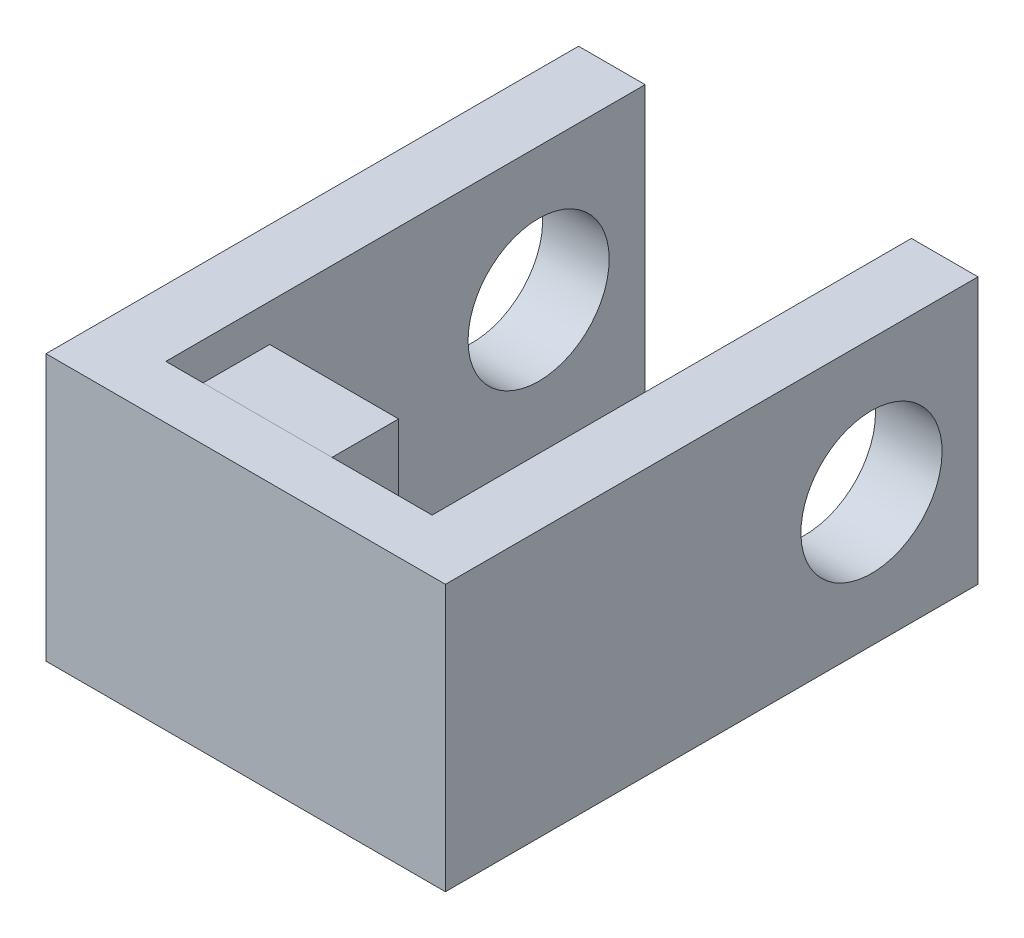
ISO-10303-21;
HEADER;
FILE_DESCRIPTION(('STEP AP214'),'2;1');
FILE_NAME('part.step','',(''),(''),'','','');
FILE_SCHEMA(('AUTOMOTIVE_DESIGN { 1 0 10303 214 1 1 1 1 }'));
ENDSEC;
DATA;
#1=APPLICATION_CONTEXT('core data for automotive mechanical design processes');
#2=APPLICATION_PROTOCOL_DEFINITION('international standard','automotive_design',2000,#1);
#3=PRODUCT_CONTEXT('',#1,'mechanical');
#4=PRODUCT('Part','Part','',(#3));
#5=PRODUCT_RELATED_PRODUCT_CATEGORY('part','',(#4));
#6=PRODUCT_DEFINITION_FORMATION('','',#4);
#7=PRODUCT_DEFINITION_CONTEXT('part definition',#1,'design');
#8=PRODUCT_DEFINITION('design','',#6,#7);
#9=PRODUCT_DEFINITION_SHAPE('','',#8);
#10=(LENGTH_UNIT() NAMED_UNIT(*) SI_UNIT(.MILLI.,.METRE.));
#11=(NAMED_UNIT(*) PLANE_ANGLE_UNIT() SI_UNIT($,.RADIAN.));
#12=(NAMED_UNIT(*) SI_UNIT($,.STERADIAN.) SOLID_ANGLE_UNIT());
#13=UNCERTAINTY_MEASURE_WITH_UNIT(LENGTH_MEASURE(1.E-05),#10,'distance_accuracy_value','');
#14=(GEOMETRIC_REPRESENTATION_CONTEXT(3) GLOBAL_UNCERTAINTY_ASSIGNED_CONTEXT((#13)) GLOBAL_UNIT_ASSIGNED_CONTEXT((#10,
#11,#12)) REPRESENTATION_CONTEXT('',''));
#15=CARTESIAN_POINT('',(0.,0.,0.));
#16=DIRECTION('',(0.,0.,1.));
#17=DIRECTION('',(1.,0.,0.));
#18=AXIS2_PLACEMENT_3D('',#15,#16,#17);
#19=CARTESIAN_POINT('',(3.9,0.,-2.5));
#20=DIRECTION('',(-1.,0.,0.));
#21=DIRECTION('',(0.,-1.,0.));
#22=AXIS2_PLACEMENT_3D('',#19,#20,#21);
#23=PLANE('',#22);
#24=DIRECTION('',(0.,-1.,0.));
#25=VECTOR('',#24,1.);
#26=CARTESIAN_POINT('',(3.9,0.,0.));
#27=LINE('',#26,#25);
#28=CARTESIAN_POINT('',(3.9,10.,0.));
#29=VERTEX_POINT('',#28);
#30=CARTESIAN_POINT('',(3.9,0.,0.));
#31=VERTEX_POINT('',#30);
#32=EDGE_CURVE('E115',#29,#31,#27,.T.);
#33=ORIENTED_EDGE('',*,*,#32,.F.);
#34=DIRECTION('',(0.,0.,1.));
#35=VECTOR('',#34,1.);
#36=CARTESIAN_POINT('',(3.9,10.,-2.5));
#37=LINE('',#36,#35);
#38=CARTESIAN_POINT('',(3.9,10.,-2.5));
#39=VERTEX_POINT('',#38);
#40=EDGE_CURVE('E12',#39,#29,#37,.T.);
#41=ORIENTED_EDGE('',*,*,#40,.F.);
#42=DIRECTION('',(0.,-1.,0.));
#43=VECTOR('',#42,1.);
#44=CARTESIAN_POINT('',(3.9,0.,-2.5));
#45=LINE('',#44,#43);
#46=CARTESIAN_POINT('',(3.9,0.,-2.5));
#47=VERTEX_POINT('',#46);
#48=EDGE_CURVE('E103',#39,#47,#45,.T.);
#49=ORIENTED_EDGE('',*,*,#48,.T.);
#50=DIRECTION('',(0.,0.,1.));
#51=VECTOR('',#50,1.);
#52=CARTESIAN_POINT('',(3.9,0.,-2.5));
#53=LINE('',#52,#51);
#54=EDGE_CURVE('E92',#47,#31,#53,.T.);
#55=ORIENTED_EDGE('',*,*,#54,.T.);
#56=EDGE_LOOP('',(#33,#41,#49,#55));
#57=FACE_BOUND('',#56,.T.);
#58=ADVANCED_FACE('F53',(#57),#23,.T.);
#59=CARTESIAN_POINT('',(0.,10.,-2.5));
#60=DIRECTION('',(0.,-1.,0.));
#61=DIRECTION('',(0.,0.,-1.));
#62=AXIS2_PLACEMENT_3D('',#59,#60,#61);
#63=PLANE('',#62);
#64=DIRECTION('',(1.,0.,0.));
#65=VECTOR('',#64,1.);
#66=CARTESIAN_POINT('',(0.,10.,0.));
#67=LINE('',#66,#65);
#68=CARTESIAN_POINT('',(8.7416448507937,10.,0.));
#69=VERTEX_POINT('',#68);
#70=EDGE_CURVE('E108',#29,#69,#67,.T.);
#71=ORIENTED_EDGE('',*,*,#70,.T.);
#72=DIRECTION('',(0.,0.,1.));
#73=VECTOR('',#72,1.);
#74=CARTESIAN_POINT('',(8.7416448507937,10.,-2.5));
#75=LINE('',#74,#73);
#76=CARTESIAN_POINT('',(8.7416448507937,10.,-2.5));
#77=VERTEX_POINT('',#76);
#78=EDGE_CURVE('E61',#77,#69,#75,.T.);
#79=ORIENTED_EDGE('',*,*,#78,.F.);
#80=DIRECTION('',(1.,0.,0.));
#81=VECTOR('',#80,1.);
#82=CARTESIAN_POINT('',(0.,10.,-2.5));
#83=LINE('',#82,#81);
#84=EDGE_CURVE('E98',#39,#77,#83,.T.);
#85=ORIENTED_EDGE('',*,*,#84,.F.);
#86=ORIENTED_EDGE('',*,*,#40,.T.);
#87=EDGE_LOOP('',(#71,#79,#85,#86));
#88=FACE_BOUND('',#87,.T.);
#89=ADVANCED_FACE('F106',(#88),#63,.F.);
#90=CARTESIAN_POINT('',(8.7416448507937,0.,-2.5));
#91=DIRECTION('',(-1.,0.,0.));
#92=DIRECTION('',(0.,-1.,0.));
#93=AXIS2_PLACEMENT_3D('',#90,#91,#92);
#94=PLANE('',#93);
#95=DIRECTION('',(0.,-1.,0.));
#96=VECTOR('',#95,1.);
#97=CARTESIAN_POINT('',(8.7416448507937,0.,0.));
#98=LINE('',#97,#96);
#99=CARTESIAN_POINT('',(8.7416448507937,0.,0.));
#100=VERTEX_POINT('',#99);
#101=EDGE_CURVE('E85',#69,#100,#98,.T.);
#102=ORIENTED_EDGE('',*,*,#101,.T.);
#103=DIRECTION('',(0.,0.,1.));
#104=VECTOR('',#103,1.);
#105=CARTESIAN_POINT('',(8.7416448507937,0.,-2.5));
#106=LINE('',#105,#104);
#107=CARTESIAN_POINT('',(8.7416448507937,0.,-2.5));
#108=VERTEX_POINT('',#107);
#109=EDGE_CURVE('E109',#108,#100,#106,.T.);
#110=ORIENTED_EDGE('',*,*,#109,.F.);
#111=DIRECTION('',(0.,-1.,0.));
#112=VECTOR('',#111,1.);
#113=CARTESIAN_POINT('',(8.7416448507937,0.,-2.5));
#114=LINE('',#113,#112);
#115=EDGE_CURVE('E102',#77,#108,#114,.T.);
#116=ORIENTED_EDGE('',*,*,#115,.F.);
#117=ORIENTED_EDGE('',*,*,#78,.T.);
#118=EDGE_LOOP('',(#102,#110,#116,#117));
#119=FACE_BOUND('',#118,.T.);
#120=ADVANCED_FACE('F110',(#119),#94,.F.);
#121=CARTESIAN_POINT('',(0.,0.,-2.5));
#122=DIRECTION('',(0.,1.,0.));
#123=DIRECTION('',(0.,0.,1.));
#124=AXIS2_PLACEMENT_3D('',#121,#122,#123);
#125=PLANE('',#124);
#126=DIRECTION('',(-1.,0.,0.));
#127=VECTOR('',#126,1.);
#128=CARTESIAN_POINT('',(0.,0.,0.));
#129=LINE('',#128,#127);
#130=EDGE_CURVE('E120',#100,#31,#129,.T.);
#131=ORIENTED_EDGE('',*,*,#130,.T.);
#132=ORIENTED_EDGE('',*,*,#54,.F.);
#133=DIRECTION('',(-1.,0.,0.));
#134=VECTOR('',#133,1.);
#135=CARTESIAN_POINT('',(0.,0.,-2.5));
#136=LINE('',#135,#134);
#137=EDGE_CURVE('E69',#108,#47,#136,.T.);
#138=ORIENTED_EDGE('',*,*,#137,.F.);
#139=ORIENTED_EDGE('',*,*,#109,.T.);
#140=EDGE_LOOP('',(#131,#132,#138,#139));
#141=FACE_BOUND('',#140,.T.);
#142=ADVANCED_FACE('F125',(#141),#125,.F.);
#143=CARTESIAN_POINT('',(0.,0.,-2.5));
#144=DIRECTION('',(0.,0.,-1.));
#145=DIRECTION('',(-1.,0.,0.));
#146=AXIS2_PLACEMENT_3D('',#143,#144,#145);
#147=PLANE('',#146);
#148=ORIENTED_EDGE('',*,*,#48,.F.);
#149=ORIENTED_EDGE('',*,*,#84,.T.);
#150=ORIENTED_EDGE('',*,*,#115,.T.);
#151=ORIENTED_EDGE('',*,*,#137,.T.);
#152=EDGE_LOOP('',(#148,#149,#150,#151));
#153=FACE_BOUND('',#152,.T.);
#154=ADVANCED_FACE('F100',(#153),#147,.T.);
#155=CARTESIAN_POINT('',(0.,0.,0.));
#156=DIRECTION('',(0.,0.,-1.));
#157=DIRECTION('',(-1.,0.,0.));
#158=AXIS2_PLACEMENT_3D('',#155,#156,#157);
#159=PLANE('',#158);
#160=ORIENTED_EDGE('',*,*,#32,.T.);
#161=ORIENTED_EDGE('',*,*,#130,.F.);
#162=ORIENTED_EDGE('',*,*,#101,.F.);
#163=ORIENTED_EDGE('',*,*,#70,.F.);
#164=EDGE_LOOP('',(#160,#161,#162,#163));
#165=FACE_BOUND('',#164,.T.);
#166=ADVANCED_FACE('F127',(#165),#159,.F.);
#167=CLOSED_SHELL('',(#58,#89,#120,#142,#154,#166));
#168=MANIFOLD_SOLID_BREP('B2',#167);
#169=CARTESIAN_POINT('',(0.,0.,0.));
#170=DIRECTION('',(0.,0.,1.));
#171=DIRECTION('',(1.,0.,0.));
#172=AXIS2_PLACEMENT_3D('',#169,#170,#171);
#173=PLANE('',#172);
#174=DIRECTION('',(0.,-1.,0.));
#175=VECTOR('',#174,1.);
#176=CARTESIAN_POINT('',(2.5,0.,0.));
#177=LINE('',#176,#175);
#178=CARTESIAN_POINT('',(2.5,10.,0.));
#179=VERTEX_POINT('',#178);
#180=CARTESIAN_POINT('',(2.5,0.,0.));
#181=VERTEX_POINT('',#180);
#182=EDGE_CURVE('E272',#179,#181,#177,.T.);
#183=ORIENTED_EDGE('',*,*,#182,.F.);
#184=DIRECTION('',(-1.,0.,0.));
#185=VECTOR('',#184,1.);
#186=CARTESIAN_POINT('',(0.,10.,0.));
#187=LINE('',#186,#185);
#188=CARTESIAN_POINT('',(12.5,10.,0.));
#189=VERTEX_POINT('',#188);
#190=EDGE_CURVE('E305',#189,#179,#187,.T.);
#191=ORIENTED_EDGE('',*,*,#190,.F.);
#192=DIRECTION('',(0.,1.,0.));
#193=VECTOR('',#192,1.);
#194=CARTESIAN_POINT('',(12.5,0.,0.));
#195=LINE('',#194,#193);
#196=CARTESIAN_POINT('',(12.5,0.,0.));
#197=VERTEX_POINT('',#196);
#198=EDGE_CURVE('E284',#197,#189,#195,.T.);
#199=ORIENTED_EDGE('',*,*,#198,.F.);
#200=DIRECTION('',(1.,0.,0.));
#201=VECTOR('',#200,1.);
#202=CARTESIAN_POINT('',(0.,0.,0.));
#203=LINE('',#202,#201);
#204=EDGE_CURVE('E198',#181,#197,#203,.T.);
#205=ORIENTED_EDGE('',*,*,#204,.F.);
#206=EDGE_LOOP('',(#183,#191,#199,#205));
#207=FACE_BOUND('',#206,.T.);
#208=ADVANCED_FACE('F182',(#207),#173,.F.);
#209=CARTESIAN_POINT('',(0.,10.,2.));
#210=DIRECTION('',(1.,0.,0.));
#211=DIRECTION('',(0.,1.,0.));
#212=AXIS2_PLACEMENT_3D('',#209,#210,#211);
#213=PLANE('',#212);
#214=CARTESIAN_POINT('',(0.,5.,-14.));
#215=DIRECTION('',(1.,0.,0.));
#216=DIRECTION('',(0.,1.,0.));
#217=AXIS2_PLACEMENT_3D('',#214,#215,#216);
#218=CIRCLE('',#217,2.65);
#219=CARTESIAN_POINT('',(0.,7.65,-14.));
#220=VERTEX_POINT('',#219);
#221=EDGE_CURVE('E451',#220,#220,#218,.T.);
#222=ORIENTED_EDGE('',*,*,#221,.T.);
#223=EDGE_LOOP('',(#222));
#224=FACE_BOUND('',#223,.T.);
#225=DIRECTION('',(0.,0.,-1.));
#226=VECTOR('',#225,1.);
#227=CARTESIAN_POINT('',(0.,10.,2.));
#228=LINE('',#227,#226);
#229=CARTESIAN_POINT('',(0.,10.,2.));
#230=VERTEX_POINT('',#229);
#231=CARTESIAN_POINT('',(0.,10.,-18.));
#232=VERTEX_POINT('',#231);
#233=EDGE_CURVE('E250',#230,#232,#228,.T.);
#234=ORIENTED_EDGE('',*,*,#233,.T.);
#235=DIRECTION('',(0.,1.,0.));
#236=VECTOR('',#235,1.);
#237=CARTESIAN_POINT('',(0.,0.,-18.));
#238=LINE('',#237,#236);
#239=CARTESIAN_POINT('',(0.,0.,-18.));
#240=VERTEX_POINT('',#239);
#241=EDGE_CURVE('E254',#240,#232,#238,.T.);
#242=ORIENTED_EDGE('',*,*,#241,.F.);
#243=DIRECTION('',(0.,0.,-1.));
#244=VECTOR('',#243,1.);
#245=CARTESIAN_POINT('',(0.,0.,2.));
#246=LINE('',#245,#244);
#247=CARTESIAN_POINT('',(0.,0.,2.));
#248=VERTEX_POINT('',#247);
#249=EDGE_CURVE('E51',#248,#240,#246,.T.);
#250=ORIENTED_EDGE('',*,*,#249,.F.);
#251=DIRECTION('',(0.,-1.,0.));
#252=VECTOR('',#251,1.);
#253=CARTESIAN_POINT('',(0.,10.,2.));
#254=LINE('',#253,#252);
#255=EDGE_CURVE('E255',#230,#248,#254,.T.);
#256=ORIENTED_EDGE('',*,*,#255,.F.);
#257=EDGE_LOOP('',(#234,#242,#250,#256));
#258=FACE_BOUND('',#257,.T.);
#259=ADVANCED_FACE('F184',(#224,#258),#213,.F.);
#260=CARTESIAN_POINT('',(0.,0.,2.));
#261=DIRECTION('',(0.,1.,0.));
#262=DIRECTION('',(0.,0.,1.));
#263=AXIS2_PLACEMENT_3D('',#260,#261,#262);
#264=PLANE('',#263);
#265=ORIENTED_EDGE('',*,*,#249,.T.);
#266=DIRECTION('',(-1.,0.,0.));
#267=VECTOR('',#266,1.);
#268=CARTESIAN_POINT('',(0.,0.,-18.));
#269=LINE('',#268,#267);
#270=CARTESIAN_POINT('',(2.5,0.,-18.));
#271=VERTEX_POINT('',#270);
#272=EDGE_CURVE('E271',#271,#240,#269,.T.);
#273=ORIENTED_EDGE('',*,*,#272,.F.);
#274=DIRECTION('',(0.,0.,1.));
#275=VECTOR('',#274,1.);
#276=CARTESIAN_POINT('',(2.5,0.,-18.));
#277=LINE('',#276,#275);
#278=EDGE_CURVE('E280',#271,#181,#277,.T.);
#279=ORIENTED_EDGE('',*,*,#278,.T.);
#280=ORIENTED_EDGE('',*,*,#204,.T.);
#281=DIRECTION('',(0.,0.,1.));
#282=VECTOR('',#281,1.);
#283=CARTESIAN_POINT('',(12.5,0.,-18.));
#284=LINE('',#283,#282);
#285=CARTESIAN_POINT('',(12.5,0.,-18.));
#286=VERTEX_POINT('',#285);
#287=EDGE_CURVE('E300',#286,#197,#284,.T.);
#288=ORIENTED_EDGE('',*,*,#287,.F.);
#289=DIRECTION('',(-1.,0.,0.));
#290=VECTOR('',#289,1.);
#291=CARTESIAN_POINT('',(15.,0.,-18.));
#292=LINE('',#291,#290);
#293=CARTESIAN_POINT('',(15.,0.,-18.));
#294=VERTEX_POINT('',#293);
#295=EDGE_CURVE('E288',#294,#286,#292,.T.);
#296=ORIENTED_EDGE('',*,*,#295,.F.);
#297=DIRECTION('',(0.,0.,-1.));
#298=VECTOR('',#297,1.);
#299=CARTESIAN_POINT('',(15.,0.,2.));
#300=LINE('',#299,#298);
#301=CARTESIAN_POINT('',(15.,0.,2.));
#302=VERTEX_POINT('',#301);
#303=EDGE_CURVE('E191',#302,#294,#300,.T.);
#304=ORIENTED_EDGE('',*,*,#303,.F.);
#305=DIRECTION('',(1.,0.,0.));
#306=VECTOR('',#305,1.);
#307=CARTESIAN_POINT('',(0.,0.,2.));
#308=LINE('',#307,#306);
#309=EDGE_CURVE('E304',#248,#302,#308,.T.);
#310=ORIENTED_EDGE('',*,*,#309,.F.);
#311=EDGE_LOOP('',(#265,#273,#279,#280,#288,#296,#304,#310));
#312=FACE_BOUND('',#311,.T.);
#313=ADVANCED_FACE('F320',(#312),#264,.F.);
#314=CARTESIAN_POINT('',(15.,10.,2.));
#315=DIRECTION('',(-1.,0.,0.));
#316=DIRECTION('',(0.,-1.,0.));
#317=AXIS2_PLACEMENT_3D('',#314,#315,#316);
#318=PLANE('',#317);
#319=CARTESIAN_POINT('',(15.,5.,-14.));
#320=DIRECTION('',(1.,0.,0.));
#321=DIRECTION('',(0.,1.,0.));
#322=AXIS2_PLACEMENT_3D('',#319,#320,#321);
#323=CIRCLE('',#322,2.65);
#324=CARTESIAN_POINT('',(15.,7.65,-14.));
#325=VERTEX_POINT('',#324);
#326=EDGE_CURVE('E454',#325,#325,#323,.T.);
#327=ORIENTED_EDGE('',*,*,#326,.F.);
#328=EDGE_LOOP('',(#327));
#329=FACE_BOUND('',#328,.T.);
#330=ORIENTED_EDGE('',*,*,#303,.T.);
#331=DIRECTION('',(0.,-1.,0.));
#332=VECTOR('',#331,1.);
#333=CARTESIAN_POINT('',(15.,0.,-18.));
#334=LINE('',#333,#332);
#335=CARTESIAN_POINT('',(15.,10.,-18.));
#336=VERTEX_POINT('',#335);
#337=EDGE_CURVE('E285',#336,#294,#334,.T.);
#338=ORIENTED_EDGE('',*,*,#337,.F.);
#339=DIRECTION('',(0.,0.,-1.));
#340=VECTOR('',#339,1.);
#341=CARTESIAN_POINT('',(15.,10.,2.));
#342=LINE('',#341,#340);
#343=CARTESIAN_POINT('',(15.,10.,2.));
#344=VERTEX_POINT('',#343);
#345=EDGE_CURVE('E257',#344,#336,#342,.T.);
#346=ORIENTED_EDGE('',*,*,#345,.F.);
#347=DIRECTION('',(0.,1.,0.));
#348=VECTOR('',#347,1.);
#349=CARTESIAN_POINT('',(15.,10.,2.));
#350=LINE('',#349,#348);
#351=EDGE_CURVE('E307',#302,#344,#350,.T.);
#352=ORIENTED_EDGE('',*,*,#351,.F.);
#353=EDGE_LOOP('',(#330,#338,#346,#352));
#354=FACE_BOUND('',#353,.T.);
#355=ADVANCED_FACE('F318',(#329,#354),#318,.F.);
#356=CARTESIAN_POINT('',(0.,10.,2.));
#357=DIRECTION('',(0.,-1.,0.));
#358=DIRECTION('',(0.,0.,-1.));
#359=AXIS2_PLACEMENT_3D('',#356,#357,#358);
#360=PLANE('',#359);
#361=ORIENTED_EDGE('',*,*,#345,.T.);
#362=DIRECTION('',(1.,0.,0.));
#363=VECTOR('',#362,1.);
#364=CARTESIAN_POINT('',(15.,10.,-18.));
#365=LINE('',#364,#363);
#366=CARTESIAN_POINT('',(12.5,10.,-18.));
#367=VERTEX_POINT('',#366);
#368=EDGE_CURVE('E292',#367,#336,#365,.T.);
#369=ORIENTED_EDGE('',*,*,#368,.F.);
#370=DIRECTION('',(0.,0.,1.));
#371=VECTOR('',#370,1.);
#372=CARTESIAN_POINT('',(12.5,10.,-18.));
#373=LINE('',#372,#371);
#374=EDGE_CURVE('E295',#367,#189,#373,.T.);
#375=ORIENTED_EDGE('',*,*,#374,.T.);
#376=ORIENTED_EDGE('',*,*,#190,.T.);
#377=DIRECTION('',(0.,0.,1.));
#378=VECTOR('',#377,1.);
#379=CARTESIAN_POINT('',(2.5,10.,-18.));
#380=LINE('',#379,#378);
#381=CARTESIAN_POINT('',(2.5,10.,-18.));
#382=VERTEX_POINT('',#381);
#383=EDGE_CURVE('E263',#382,#179,#380,.T.);
#384=ORIENTED_EDGE('',*,*,#383,.F.);
#385=DIRECTION('',(1.,0.,0.));
#386=VECTOR('',#385,1.);
#387=CARTESIAN_POINT('',(0.,10.,-18.));
#388=LINE('',#387,#386);
#389=EDGE_CURVE('E260',#232,#382,#388,.T.);
#390=ORIENTED_EDGE('',*,*,#389,.F.);
#391=ORIENTED_EDGE('',*,*,#233,.F.);
#392=DIRECTION('',(-1.,0.,0.));
#393=VECTOR('',#392,1.);
#394=CARTESIAN_POINT('',(0.,10.,2.));
#395=LINE('',#394,#393);
#396=EDGE_CURVE('E206',#344,#230,#395,.T.);
#397=ORIENTED_EDGE('',*,*,#396,.F.);
#398=EDGE_LOOP('',(#361,#369,#375,#376,#384,#390,#391,#397));
#399=FACE_BOUND('',#398,.T.);
#400=ADVANCED_FACE('F261',(#399),#360,.F.);
#401=CARTESIAN_POINT('',(0.,0.,2.));
#402=DIRECTION('',(0.,0.,1.));
#403=DIRECTION('',(1.,0.,0.));
#404=AXIS2_PLACEMENT_3D('',#401,#402,#403);
#405=PLANE('',#404);
#406=ORIENTED_EDGE('',*,*,#255,.T.);
#407=ORIENTED_EDGE('',*,*,#309,.T.);
#408=ORIENTED_EDGE('',*,*,#351,.T.);
#409=ORIENTED_EDGE('',*,*,#396,.T.);
#410=EDGE_LOOP('',(#406,#407,#408,#409));
#411=FACE_BOUND('',#410,.T.);
#412=ADVANCED_FACE('F333',(#411),#405,.T.);
#413=CARTESIAN_POINT('',(12.5,0.,-18.));
#414=DIRECTION('',(1.,0.,0.));
#415=DIRECTION('',(0.,0.,-1.));
#416=AXIS2_PLACEMENT_3D('',#413,#414,#415);
#417=PLANE('',#416);
#418=CARTESIAN_POINT('',(12.5,5.,-14.));
#419=DIRECTION('',(1.,0.,0.));
#420=DIRECTION('',(0.,0.,-1.));
#421=AXIS2_PLACEMENT_3D('',#418,#419,#420);
#422=CIRCLE('',#421,2.65);
#423=CARTESIAN_POINT('',(12.5,5.,-16.65));
#424=VERTEX_POINT('',#423);
#425=EDGE_CURVE('E274',#424,#424,#422,.T.);
#426=ORIENTED_EDGE('',*,*,#425,.T.);
#427=EDGE_LOOP('',(#426));
#428=FACE_BOUND('',#427,.T.);
#429=ORIENTED_EDGE('',*,*,#198,.T.);
#430=ORIENTED_EDGE('',*,*,#374,.F.);
#431=DIRECTION('',(0.,1.,0.));
#432=VECTOR('',#431,1.);
#433=CARTESIAN_POINT('',(12.5,0.,-18.));
#434=LINE('',#433,#432);
#435=EDGE_CURVE('E290',#286,#367,#434,.T.);
#436=ORIENTED_EDGE('',*,*,#435,.F.);
#437=ORIENTED_EDGE('',*,*,#287,.T.);
#438=EDGE_LOOP('',(#429,#430,#436,#437));
#439=FACE_BOUND('',#438,.T.);
#440=ADVANCED_FACE('F327',(#428,#439),#417,.F.);
#441=CARTESIAN_POINT('',(0.,0.,-18.));
#442=DIRECTION('',(0.,0.,1.));
#443=DIRECTION('',(1.,0.,0.));
#444=AXIS2_PLACEMENT_3D('',#441,#442,#443);
#445=PLANE('',#444);
#446=ORIENTED_EDGE('',*,*,#337,.T.);
#447=ORIENTED_EDGE('',*,*,#295,.T.);
#448=ORIENTED_EDGE('',*,*,#435,.T.);
#449=ORIENTED_EDGE('',*,*,#368,.T.);
#450=EDGE_LOOP('',(#446,#447,#448,#449));
#451=FACE_BOUND('',#450,.T.);
#452=ADVANCED_FACE('F323',(#451),#445,.F.);
#453=CARTESIAN_POINT('',(2.5,0.,-18.));
#454=DIRECTION('',(-1.,0.,0.));
#455=DIRECTION('',(0.,-1.,0.));
#456=AXIS2_PLACEMENT_3D('',#453,#454,#455);
#457=PLANE('',#456);
#458=CARTESIAN_POINT('',(2.5,5.,-14.));
#459=DIRECTION('',(-1.,0.,0.));
#460=DIRECTION('',(0.,-1.,0.));
#461=AXIS2_PLACEMENT_3D('',#458,#459,#460);
#462=CIRCLE('',#461,2.65);
#463=CARTESIAN_POINT('',(2.5,2.35,-14.));
#464=VERTEX_POINT('',#463);
#465=EDGE_CURVE('E186',#464,#464,#462,.T.);
#466=ORIENTED_EDGE('',*,*,#465,.T.);
#467=EDGE_LOOP('',(#466));
#468=FACE_BOUND('',#467,.T.);
#469=ORIENTED_EDGE('',*,*,#182,.T.);
#470=ORIENTED_EDGE('',*,*,#278,.F.);
#471=DIRECTION('',(0.,-1.,0.));
#472=VECTOR('',#471,1.);
#473=CARTESIAN_POINT('',(2.5,0.,-18.));
#474=LINE('',#473,#472);
#475=EDGE_CURVE('E266',#382,#271,#474,.T.);
#476=ORIENTED_EDGE('',*,*,#475,.F.);
#477=ORIENTED_EDGE('',*,*,#383,.T.);
#478=EDGE_LOOP('',(#469,#470,#476,#477));
#479=FACE_BOUND('',#478,.T.);
#480=ADVANCED_FACE('F332',(#468,#479),#457,.F.);
#481=CARTESIAN_POINT('',(0.,0.,-18.));
#482=DIRECTION('',(0.,0.,-1.));
#483=DIRECTION('',(-1.,0.,0.));
#484=AXIS2_PLACEMENT_3D('',#481,#482,#483);
#485=PLANE('',#484);
#486=ORIENTED_EDGE('',*,*,#241,.T.);
#487=ORIENTED_EDGE('',*,*,#389,.T.);
#488=ORIENTED_EDGE('',*,*,#475,.T.);
#489=ORIENTED_EDGE('',*,*,#272,.T.);
#490=EDGE_LOOP('',(#486,#487,#488,#489));
#491=FACE_BOUND('',#490,.T.);
#492=ADVANCED_FACE('F269',(#491),#485,.T.);
#493=CARTESIAN_POINT('',(0.,5.,-14.));
#494=DIRECTION('',(1.,0.,0.));
#495=DIRECTION('',(0.,1.,0.));
#496=AXIS2_PLACEMENT_3D('',#493,#494,#495);
#497=CYLINDRICAL_SURFACE('',#496,2.65);
#498=ORIENTED_EDGE('',*,*,#221,.F.);
#499=EDGE_LOOP('',(#498));
#500=FACE_BOUND('',#499,.T.);
#501=ORIENTED_EDGE('',*,*,#465,.F.);
#502=EDGE_LOOP('',(#501));
#503=FACE_BOUND('',#502,.T.);
#504=ADVANCED_FACE('F386',(#500,#503),#497,.F.);
#505=ORIENTED_EDGE('',*,*,#326,.T.);
#506=EDGE_LOOP('',(#505));
#507=FACE_BOUND('',#506,.T.);
#508=ORIENTED_EDGE('',*,*,#425,.F.);
#509=EDGE_LOOP('',(#508));
#510=FACE_BOUND('',#509,.T.);
#511=ADVANCED_FACE('F431',(#507,#510),#497,.F.);
#512=CLOSED_SHELL('',(#208,#259,#313,#355,#400,#412,#440,#452,#480,#492,#504,#511));
#513=MANIFOLD_SOLID_BREP('B6',#512);
#514=ADVANCED_BREP_SHAPE_REPRESENTATION('',(#18,#168,#513),#14);
#515=SHAPE_DEFINITION_REPRESENTATION(#9,#514);
ENDSEC;
END-ISO-10303-21;
